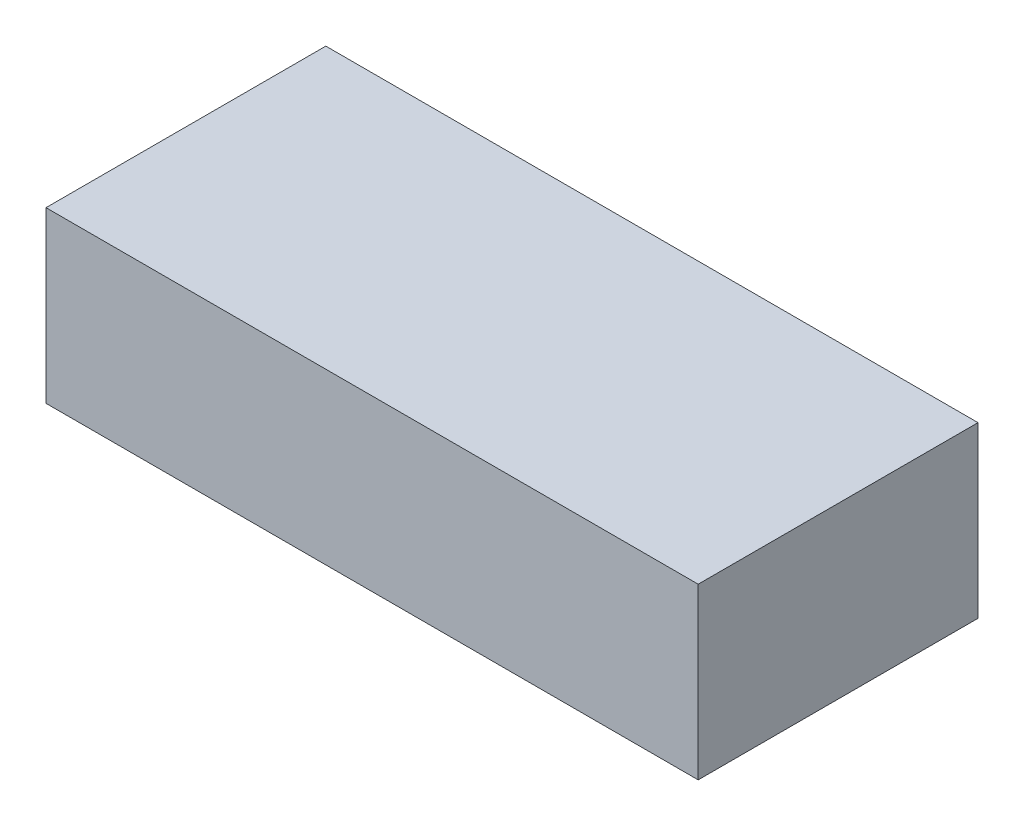
ISO-10303-21;
HEADER;
FILE_DESCRIPTION(('STEP AP214'),'2;1');
FILE_NAME('part.step','',(''),(''),'','','');
FILE_SCHEMA(('AUTOMOTIVE_DESIGN { 1 0 10303 214 1 1 1 1 }'));
ENDSEC;
DATA;
#1=APPLICATION_CONTEXT('core data for automotive mechanical design processes');
#2=APPLICATION_PROTOCOL_DEFINITION('international standard','automotive_design',2000,#1);
#3=PRODUCT_CONTEXT('',#1,'mechanical');
#4=PRODUCT('Part','Part','',(#3));
#5=PRODUCT_RELATED_PRODUCT_CATEGORY('part','',(#4));
#6=PRODUCT_DEFINITION_FORMATION('','',#4);
#7=PRODUCT_DEFINITION_CONTEXT('part definition',#1,'design');
#8=PRODUCT_DEFINITION('design','',#6,#7);
#9=PRODUCT_DEFINITION_SHAPE('','',#8);
#10=(LENGTH_UNIT() NAMED_UNIT(*) SI_UNIT(.MILLI.,.METRE.));
#11=(NAMED_UNIT(*) PLANE_ANGLE_UNIT() SI_UNIT($,.RADIAN.));
#12=(NAMED_UNIT(*) SI_UNIT($,.STERADIAN.) SOLID_ANGLE_UNIT());
#13=UNCERTAINTY_MEASURE_WITH_UNIT(LENGTH_MEASURE(1.E-05),#10,'distance_accuracy_value','');
#14=(GEOMETRIC_REPRESENTATION_CONTEXT(3) GLOBAL_UNCERTAINTY_ASSIGNED_CONTEXT((#13)) GLOBAL_UNIT_ASSIGNED_CONTEXT((#10,
#11,#12)) REPRESENTATION_CONTEXT('',''));
#15=CARTESIAN_POINT('',(0.,0.,0.));
#16=DIRECTION('',(0.,0.,1.));
#17=DIRECTION('',(1.,0.,0.));
#18=AXIS2_PLACEMENT_3D('',#15,#16,#17);
#19=CARTESIAN_POINT('',(38.481,19.999999878,16.51));
#20=DIRECTION('',(-1.,0.,0.));
#21=DIRECTION('',(0.,0.,1.));
#22=AXIS2_PLACEMENT_3D('',#19,#20,#21);
#23=PLANE('',#22);
#24=DIRECTION('',(0.,0.,-1.));
#25=VECTOR('',#24,1.);
#26=CARTESIAN_POINT('',(38.481,0.,16.51));
#27=LINE('',#26,#25);
#28=CARTESIAN_POINT('',(38.481,0.,16.51));
#29=VERTEX_POINT('',#28);
#30=CARTESIAN_POINT('',(38.481,0.,-16.51));
#31=VERTEX_POINT('',#30);
#32=EDGE_CURVE('E96',#29,#31,#27,.T.);
#33=ORIENTED_EDGE('',*,*,#32,.T.);
#34=DIRECTION('',(0.,-1.,0.));
#35=VECTOR('',#34,1.);
#36=CARTESIAN_POINT('',(38.481,19.999999878,-16.51));
#37=LINE('',#36,#35);
#38=CARTESIAN_POINT('',(38.481,19.999999878,-16.51));
#39=VERTEX_POINT('',#38);
#40=EDGE_CURVE('E11',#39,#31,#37,.T.);
#41=ORIENTED_EDGE('',*,*,#40,.F.);
#42=DIRECTION('',(0.,0.,-1.));
#43=VECTOR('',#42,1.);
#44=CARTESIAN_POINT('',(38.481,19.999999878,16.51));
#45=LINE('',#44,#43);
#46=CARTESIAN_POINT('',(38.481,19.999999878,16.51));
#47=VERTEX_POINT('',#46);
#48=EDGE_CURVE('E84',#47,#39,#45,.T.);
#49=ORIENTED_EDGE('',*,*,#48,.F.);
#50=DIRECTION('',(0.,-1.,0.));
#51=VECTOR('',#50,1.);
#52=CARTESIAN_POINT('',(38.481,19.999999878,16.51));
#53=LINE('',#52,#51);
#54=EDGE_CURVE('E92',#47,#29,#53,.T.);
#55=ORIENTED_EDGE('',*,*,#54,.T.);
#56=EDGE_LOOP('',(#33,#41,#49,#55));
#57=FACE_BOUND('',#56,.T.);
#58=ADVANCED_FACE('F33',(#57),#23,.F.);
#59=CARTESIAN_POINT('',(-38.481,19.999999878,-16.51));
#60=DIRECTION('',(0.,0.,1.));
#61=DIRECTION('',(1.,0.,0.));
#62=AXIS2_PLACEMENT_3D('',#59,#60,#61);
#63=PLANE('',#62);
#64=DIRECTION('',(-1.,0.,0.));
#65=VECTOR('',#64,1.);
#66=CARTESIAN_POINT('',(-38.481,0.,-16.51));
#67=LINE('',#66,#65);
#68=CARTESIAN_POINT('',(-38.481,0.,-16.51));
#69=VERTEX_POINT('',#68);
#70=EDGE_CURVE('E88',#31,#69,#67,.T.);
#71=ORIENTED_EDGE('',*,*,#70,.T.);
#72=DIRECTION('',(0.,-1.,0.));
#73=VECTOR('',#72,1.);
#74=CARTESIAN_POINT('',(-38.481,19.999999878,-16.51));
#75=LINE('',#74,#73);
#76=CARTESIAN_POINT('',(-38.481,19.999999878,-16.51));
#77=VERTEX_POINT('',#76);
#78=EDGE_CURVE('E41',#77,#69,#75,.T.);
#79=ORIENTED_EDGE('',*,*,#78,.F.);
#80=DIRECTION('',(-1.,0.,0.));
#81=VECTOR('',#80,1.);
#82=CARTESIAN_POINT('',(-38.481,19.999999878,-16.51));
#83=LINE('',#82,#81);
#84=EDGE_CURVE('E79',#39,#77,#83,.T.);
#85=ORIENTED_EDGE('',*,*,#84,.F.);
#86=ORIENTED_EDGE('',*,*,#40,.T.);
#87=EDGE_LOOP('',(#71,#79,#85,#86));
#88=FACE_BOUND('',#87,.T.);
#89=ADVANCED_FACE('F87',(#88),#63,.F.);
#90=CARTESIAN_POINT('',(-38.481,19.999999878,16.51));
#91=DIRECTION('',(1.,0.,0.));
#92=DIRECTION('',(0.,0.,-1.));
#93=AXIS2_PLACEMENT_3D('',#90,#91,#92);
#94=PLANE('',#93);
#95=DIRECTION('',(0.,0.,1.));
#96=VECTOR('',#95,1.);
#97=CARTESIAN_POINT('',(-38.481,0.,16.51));
#98=LINE('',#97,#96);
#99=CARTESIAN_POINT('',(-38.481,0.,16.51));
#100=VERTEX_POINT('',#99);
#101=EDGE_CURVE('E66',#69,#100,#98,.T.);
#102=ORIENTED_EDGE('',*,*,#101,.T.);
#103=DIRECTION('',(0.,-1.,0.));
#104=VECTOR('',#103,1.);
#105=CARTESIAN_POINT('',(-38.481,19.999999878,16.51));
#106=LINE('',#105,#104);
#107=CARTESIAN_POINT('',(-38.481,19.999999878,16.51));
#108=VERTEX_POINT('',#107);
#109=EDGE_CURVE('E89',#108,#100,#106,.T.);
#110=ORIENTED_EDGE('',*,*,#109,.F.);
#111=DIRECTION('',(0.,0.,1.));
#112=VECTOR('',#111,1.);
#113=CARTESIAN_POINT('',(-38.481,19.999999878,16.51));
#114=LINE('',#113,#112);
#115=EDGE_CURVE('E82',#77,#108,#114,.T.);
#116=ORIENTED_EDGE('',*,*,#115,.F.);
#117=ORIENTED_EDGE('',*,*,#78,.T.);
#118=EDGE_LOOP('',(#102,#110,#116,#117));
#119=FACE_BOUND('',#118,.T.);
#120=ADVANCED_FACE('F90',(#119),#94,.F.);
#121=CARTESIAN_POINT('',(-38.481,19.999999878,16.51));
#122=DIRECTION('',(0.,0.,-1.));
#123=DIRECTION('',(-1.,0.,0.));
#124=AXIS2_PLACEMENT_3D('',#121,#122,#123);
#125=PLANE('',#124);
#126=DIRECTION('',(1.,0.,0.));
#127=VECTOR('',#126,1.);
#128=CARTESIAN_POINT('',(-38.481,0.,16.51));
#129=LINE('',#128,#127);
#130=EDGE_CURVE('E72',#100,#29,#129,.T.);
#131=ORIENTED_EDGE('',*,*,#130,.T.);
#132=ORIENTED_EDGE('',*,*,#54,.F.);
#133=DIRECTION('',(1.,0.,0.));
#134=VECTOR('',#133,1.);
#135=CARTESIAN_POINT('',(-38.481,19.999999878,16.51));
#136=LINE('',#135,#134);
#137=EDGE_CURVE('E49',#108,#47,#136,.T.);
#138=ORIENTED_EDGE('',*,*,#137,.F.);
#139=ORIENTED_EDGE('',*,*,#109,.T.);
#140=EDGE_LOOP('',(#131,#132,#138,#139));
#141=FACE_BOUND('',#140,.T.);
#142=ADVANCED_FACE('F103',(#141),#125,.F.);
#143=CARTESIAN_POINT('',(0.,19.999999878,0.));
#144=DIRECTION('',(0.,-1.,0.));
#145=DIRECTION('',(0.,0.,-1.));
#146=AXIS2_PLACEMENT_3D('',#143,#144,#145);
#147=PLANE('',#146);
#148=ORIENTED_EDGE('',*,*,#48,.T.);
#149=ORIENTED_EDGE('',*,*,#84,.T.);
#150=ORIENTED_EDGE('',*,*,#115,.T.);
#151=ORIENTED_EDGE('',*,*,#137,.T.);
#152=EDGE_LOOP('',(#148,#149,#150,#151));
#153=FACE_BOUND('',#152,.T.);
#154=ADVANCED_FACE('F80',(#153),#147,.F.);
#155=CARTESIAN_POINT('',(0.,0.,0.));
#156=DIRECTION('',(0.,-1.,0.));
#157=DIRECTION('',(0.,0.,-1.));
#158=AXIS2_PLACEMENT_3D('',#155,#156,#157);
#159=PLANE('',#158);
#160=ORIENTED_EDGE('',*,*,#32,.F.);
#161=ORIENTED_EDGE('',*,*,#130,.F.);
#162=ORIENTED_EDGE('',*,*,#101,.F.);
#163=ORIENTED_EDGE('',*,*,#70,.F.);
#164=EDGE_LOOP('',(#160,#161,#162,#163));
#165=FACE_BOUND('',#164,.T.);
#166=ADVANCED_FACE('F106',(#165),#159,.T.);
#167=CLOSED_SHELL('',(#58,#89,#120,#142,#154,#166));
#168=MANIFOLD_SOLID_BREP('B2',#167);
#169=ADVANCED_BREP_SHAPE_REPRESENTATION('',(#18,#168),#14);
#170=SHAPE_DEFINITION_REPRESENTATION(#9,#169);
ENDSEC;
END-ISO-10303-21;
